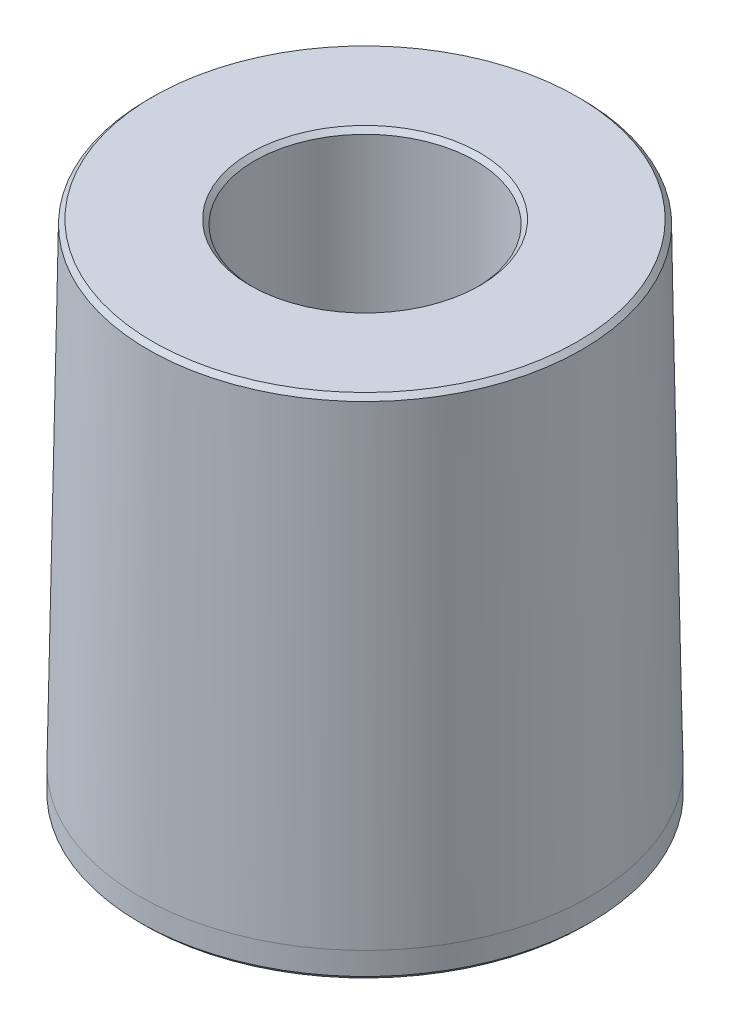
ISO-10303-21;
HEADER;
FILE_DESCRIPTION(('STEP AP214'),'2;1');
FILE_NAME('part.step','',(''),(''),'','','');
FILE_SCHEMA(('AUTOMOTIVE_DESIGN { 1 0 10303 214 1 1 1 1 }'));
ENDSEC;
DATA;
#1=APPLICATION_CONTEXT('core data for automotive mechanical design processes');
#2=APPLICATION_PROTOCOL_DEFINITION('international standard','automotive_design',2000,#1);
#3=PRODUCT_CONTEXT('',#1,'mechanical');
#4=PRODUCT('Part','Part','',(#3));
#5=PRODUCT_RELATED_PRODUCT_CATEGORY('part','',(#4));
#6=PRODUCT_DEFINITION_FORMATION('','',#4);
#7=PRODUCT_DEFINITION_CONTEXT('part definition',#1,'design');
#8=PRODUCT_DEFINITION('design','',#6,#7);
#9=PRODUCT_DEFINITION_SHAPE('','',#8);
#10=(LENGTH_UNIT() NAMED_UNIT(*) SI_UNIT(.MILLI.,.METRE.));
#11=(NAMED_UNIT(*) PLANE_ANGLE_UNIT() SI_UNIT($,.RADIAN.));
#12=(NAMED_UNIT(*) SI_UNIT($,.STERADIAN.) SOLID_ANGLE_UNIT());
#13=UNCERTAINTY_MEASURE_WITH_UNIT(LENGTH_MEASURE(1.E-05),#10,'distance_accuracy_value','');
#14=(GEOMETRIC_REPRESENTATION_CONTEXT(3) GLOBAL_UNCERTAINTY_ASSIGNED_CONTEXT((#13)) GLOBAL_UNIT_ASSIGNED_CONTEXT((#10,
#11,#12)) REPRESENTATION_CONTEXT('',''));
#15=CARTESIAN_POINT('',(0.,0.,0.));
#16=DIRECTION('',(0.,0.,1.));
#17=DIRECTION('',(1.,0.,0.));
#18=AXIS2_PLACEMENT_3D('',#15,#16,#17);
#19=CARTESIAN_POINT('',(-47.9999999999999,104.960440745704,0.));
#20=DIRECTION('',(0.,-1.,0.));
#21=DIRECTION('',(1.,0.,0.));
#22=AXIS2_PLACEMENT_3D('',#19,#20,#21);
#23=PLANE('',#22);
#24=CARTESIAN_POINT('',(0.,104.960440745704,0.));
#25=DIRECTION('',(0.,-1.,0.));
#26=DIRECTION('',(1.,0.,0.));
#27=AXIS2_PLACEMENT_3D('',#24,#25,#26);
#28=CIRCLE('',#27,25.45);
#29=CARTESIAN_POINT('',(25.45,104.960440745704,0.));
#30=VERTEX_POINT('',#29);
#31=EDGE_CURVE('E42',#30,#30,#28,.T.);
#32=ORIENTED_EDGE('',*,*,#31,.T.);
#33=EDGE_LOOP('',(#32));
#34=FACE_BOUND('',#33,.T.);
#35=CARTESIAN_POINT('',(0.,104.960440745704,0.));
#36=DIRECTION('',(0.,-1.,0.));
#37=DIRECTION('',(1.,0.,0.));
#38=AXIS2_PLACEMENT_3D('',#35,#36,#37);
#39=CIRCLE('',#38,46.9999999999999);
#40=CARTESIAN_POINT('',(46.9999999999999,104.960440745704,0.));
#41=VERTEX_POINT('',#40);
#42=EDGE_CURVE('E46',#41,#41,#39,.F.);
#43=ORIENTED_EDGE('',*,*,#42,.T.);
#44=EDGE_LOOP('',(#43));
#45=FACE_BOUND('',#44,.T.);
#46=ADVANCED_FACE('F31',(#34,#45),#23,.F.);
#47=CARTESIAN_POINT('',(0.,104.960440745704,0.));
#48=DIRECTION('',(0.,-1.,0.));
#49=DIRECTION('',(1.,0.,0.));
#50=AXIS2_PLACEMENT_3D('',#47,#48,#49);
#51=CONICAL_SURFACE('',#50,47.9999999999999,0.0174532925199364);
#52=CARTESIAN_POINT('',(0.,103.942675588809,0.));
#53=DIRECTION('',(0.,1.,0.));
#54=DIRECTION('',(-1.,0.,0.));
#55=AXIS2_PLACEMENT_3D('',#52,#53,#54);
#56=CIRCLE('',#55,48.0177651568952);
#57=CARTESIAN_POINT('',(-48.0177651568952,103.942675588809,0.));
#58=VERTEX_POINT('',#57);
#59=EDGE_CURVE('E10',#58,#58,#56,.F.);
#60=ORIENTED_EDGE('',*,*,#59,.T.);
#61=EDGE_LOOP('',(#60));
#62=FACE_BOUND('',#61,.T.);
#63=CARTESIAN_POINT('',(0.,-0.0395592542957179,0.));
#64=DIRECTION('',(0.,-1.,0.));
#65=DIRECTION('',(1.,0.,0.));
#66=AXIS2_PLACEMENT_3D('',#63,#64,#65);
#67=CIRCLE('',#66,49.832781817462);
#68=CARTESIAN_POINT('',(49.832781817462,-0.0395592542957179,0.));
#69=VERTEX_POINT('',#68);
#70=EDGE_CURVE('E63',#69,#69,#67,.T.);
#71=ORIENTED_EDGE('',*,*,#70,.F.);
#72=EDGE_LOOP('',(#71));
#73=FACE_BOUND('',#72,.T.);
#74=ADVANCED_FACE('F93',(#62,#73),#51,.T.);
#75=CARTESIAN_POINT('',(0.,0.,0.));
#76=DIRECTION('',(0.,-1.,0.));
#77=DIRECTION('',(1.,0.,0.));
#78=AXIS2_PLACEMENT_3D('',#75,#76,#77);
#79=CYLINDRICAL_SURFACE('',#78,49.8327818174621);
#80=CARTESIAN_POINT('',(0.,-5.03955925429578,0.));
#81=DIRECTION('',(0.,1.,0.));
#82=DIRECTION('',(-1.,0.,0.));
#83=AXIS2_PLACEMENT_3D('',#80,#81,#82);
#84=CIRCLE('',#83,49.8327818174621);
#85=CARTESIAN_POINT('',(-49.8327818174621,-5.03955925429578,0.));
#86=VERTEX_POINT('',#85);
#87=EDGE_CURVE('E54',#86,#86,#84,.T.);
#88=ORIENTED_EDGE('',*,*,#87,.T.);
#89=EDGE_LOOP('',(#88));
#90=FACE_BOUND('',#89,.T.);
#91=ORIENTED_EDGE('',*,*,#70,.T.);
#92=EDGE_LOOP('',(#91));
#93=FACE_BOUND('',#92,.T.);
#94=ADVANCED_FACE('F89',(#90,#93),#79,.T.);
#95=CARTESIAN_POINT('',(-23.45,-6.03955925429572,0.));
#96=DIRECTION('',(0.,1.,0.));
#97=DIRECTION('',(-1.,0.,0.));
#98=AXIS2_PLACEMENT_3D('',#95,#96,#97);
#99=PLANE('',#98);
#100=CARTESIAN_POINT('',(0.,-6.03955925429572,0.));
#101=DIRECTION('',(0.,1.,0.));
#102=DIRECTION('',(-1.,0.,0.));
#103=AXIS2_PLACEMENT_3D('',#100,#101,#102);
#104=CIRCLE('',#103,48.8327818174621);
#105=CARTESIAN_POINT('',(-48.8327818174621,-6.03955925429572,0.));
#106=VERTEX_POINT('',#105);
#107=EDGE_CURVE('E57',#106,#106,#104,.F.);
#108=ORIENTED_EDGE('',*,*,#107,.T.);
#109=EDGE_LOOP('',(#108));
#110=FACE_BOUND('',#109,.T.);
#111=CARTESIAN_POINT('',(0.,-6.03955925429572,0.));
#112=DIRECTION('',(0.,1.,0.));
#113=DIRECTION('',(-1.,0.,0.));
#114=AXIS2_PLACEMENT_3D('',#111,#112,#113);
#115=CIRCLE('',#114,24.4500000000001);
#116=CARTESIAN_POINT('',(-24.4500000000001,-6.03955925429572,0.));
#117=VERTEX_POINT('',#116);
#118=EDGE_CURVE('E60',#117,#117,#115,.T.);
#119=ORIENTED_EDGE('',*,*,#118,.T.);
#120=EDGE_LOOP('',(#119));
#121=FACE_BOUND('',#120,.T.);
#122=ADVANCED_FACE('F83',(#110,#121),#99,.F.);
#123=CARTESIAN_POINT('',(0.,0.,0.));
#124=DIRECTION('',(0.,-1.,0.));
#125=DIRECTION('',(1.,0.,0.));
#126=AXIS2_PLACEMENT_3D('',#123,#124,#125);
#127=CYLINDRICAL_SURFACE('',#126,23.45);
#128=CARTESIAN_POINT('',(0.,-5.03955925429569,0.));
#129=DIRECTION('',(0.,1.,0.));
#130=DIRECTION('',(-1.,0.,0.));
#131=AXIS2_PLACEMENT_3D('',#128,#129,#130);
#132=CIRCLE('',#131,23.45);
#133=CARTESIAN_POINT('',(-23.45,-5.03955925429569,0.));
#134=VERTEX_POINT('',#133);
#135=EDGE_CURVE('E51',#134,#134,#132,.F.);
#136=ORIENTED_EDGE('',*,*,#135,.T.);
#137=EDGE_LOOP('',(#136));
#138=FACE_BOUND('',#137,.T.);
#139=CARTESIAN_POINT('',(0.,13.9604407457043,0.));
#140=DIRECTION('',(0.,-1.,0.));
#141=DIRECTION('',(1.,0.,0.));
#142=AXIS2_PLACEMENT_3D('',#139,#140,#141);
#143=CIRCLE('',#142,23.45);
#144=CARTESIAN_POINT('',(23.45,13.9604407457043,0.));
#145=VERTEX_POINT('',#144);
#146=EDGE_CURVE('E66',#145,#145,#143,.T.);
#147=ORIENTED_EDGE('',*,*,#146,.F.);
#148=EDGE_LOOP('',(#147));
#149=FACE_BOUND('',#148,.T.);
#150=ADVANCED_FACE('F78',(#138,#149),#127,.F.);
#151=CARTESIAN_POINT('',(0.,14.9604407457043,0.));
#152=DIRECTION('',(0.,-1.,0.));
#153=DIRECTION('',(1.,0.,0.));
#154=AXIS2_PLACEMENT_3D('',#151,#152,#153);
#155=TOROIDAL_SURFACE('',#154,23.45,0.999999999999999);
#156=CARTESIAN_POINT('',(0.,14.9604407457043,0.));
#157=DIRECTION('',(0.,-1.,0.));
#158=DIRECTION('',(1.,0.,0.));
#159=AXIS2_PLACEMENT_3D('',#156,#157,#158);
#160=CIRCLE('',#159,24.45);
#161=CARTESIAN_POINT('',(24.45,14.9604407457043,0.));
#162=VERTEX_POINT('',#161);
#163=EDGE_CURVE('E69',#162,#162,#160,.T.);
#164=ORIENTED_EDGE('',*,*,#163,.F.);
#165=EDGE_LOOP('',(#164));
#166=FACE_BOUND('',#165,.T.);
#167=ORIENTED_EDGE('',*,*,#146,.T.);
#168=EDGE_LOOP('',(#167));
#169=FACE_BOUND('',#168,.T.);
#170=ADVANCED_FACE('F75',(#166,#169),#155,.F.);
#171=CARTESIAN_POINT('',(0.,0.,0.));
#172=DIRECTION('',(0.,-1.,0.));
#173=DIRECTION('',(1.,0.,0.));
#174=AXIS2_PLACEMENT_3D('',#171,#172,#173);
#175=CYLINDRICAL_SURFACE('',#174,24.45);
#176=CARTESIAN_POINT('',(0.,103.960440745704,0.));
#177=DIRECTION('',(0.,-1.,0.));
#178=DIRECTION('',(1.,0.,0.));
#179=AXIS2_PLACEMENT_3D('',#176,#177,#178);
#180=CIRCLE('',#179,24.45);
#181=CARTESIAN_POINT('',(24.45,103.960440745704,0.));
#182=VERTEX_POINT('',#181);
#183=EDGE_CURVE('E38',#182,#182,#180,.F.);
#184=ORIENTED_EDGE('',*,*,#183,.T.);
#185=EDGE_LOOP('',(#184));
#186=FACE_BOUND('',#185,.T.);
#187=ORIENTED_EDGE('',*,*,#163,.T.);
#188=EDGE_LOOP('',(#187));
#189=FACE_BOUND('',#188,.T.);
#190=ADVANCED_FACE('F73',(#186,#189),#175,.F.);
#191=CARTESIAN_POINT('',(0.,-6.03955925429572,0.));
#192=DIRECTION('',(0.,1.,0.));
#193=DIRECTION('',(-1.,0.,0.));
#194=AXIS2_PLACEMENT_3D('',#191,#192,#193);
#195=CONICAL_SURFACE('',#194,48.8327818174621,0.785398163397448);
#196=ORIENTED_EDGE('',*,*,#87,.F.);
#197=EDGE_LOOP('',(#196));
#198=FACE_BOUND('',#197,.T.);
#199=ORIENTED_EDGE('',*,*,#107,.F.);
#200=EDGE_LOOP('',(#199));
#201=FACE_BOUND('',#200,.T.);
#202=ADVANCED_FACE('F103',(#198,#201),#195,.T.);
#203=CARTESIAN_POINT('',(0.,-5.03955925429569,0.));
#204=DIRECTION('',(0.,-1.,0.));
#205=DIRECTION('',(1.,0.,0.));
#206=AXIS2_PLACEMENT_3D('',#203,#204,#205);
#207=CONICAL_SURFACE('',#206,23.45,0.785398163397462);
#208=ORIENTED_EDGE('',*,*,#118,.F.);
#209=EDGE_LOOP('',(#208));
#210=FACE_BOUND('',#209,.T.);
#211=ORIENTED_EDGE('',*,*,#135,.F.);
#212=EDGE_LOOP('',(#211));
#213=FACE_BOUND('',#212,.T.);
#214=ADVANCED_FACE('F106',(#210,#213),#207,.F.);
#215=CARTESIAN_POINT('',(0.,104.960440745704,0.));
#216=DIRECTION('',(0.,1.,0.));
#217=DIRECTION('',(-1.,0.,0.));
#218=AXIS2_PLACEMENT_3D('',#215,#216,#217);
#219=CONICAL_SURFACE('',#218,25.45,0.78539816339744);
#220=ORIENTED_EDGE('',*,*,#183,.F.);
#221=EDGE_LOOP('',(#220));
#222=FACE_BOUND('',#221,.T.);
#223=ORIENTED_EDGE('',*,*,#31,.F.);
#224=EDGE_LOOP('',(#223));
#225=FACE_BOUND('',#224,.T.);
#226=ADVANCED_FACE('F109',(#222,#225),#219,.F.);
#227=CARTESIAN_POINT('',(0.,103.942675588809,0.));
#228=DIRECTION('',(0.,-1.,0.));
#229=DIRECTION('',(1.,0.,0.));
#230=AXIS2_PLACEMENT_3D('',#227,#228,#229);
#231=CONICAL_SURFACE('',#230,48.0177651568952,0.785398163397448);
#232=ORIENTED_EDGE('',*,*,#42,.F.);
#233=EDGE_LOOP('',(#232));
#234=FACE_BOUND('',#233,.T.);
#235=ORIENTED_EDGE('',*,*,#59,.F.);
#236=EDGE_LOOP('',(#235));
#237=FACE_BOUND('',#236,.T.);
#238=ADVANCED_FACE('F33',(#234,#237),#231,.T.);
#239=CLOSED_SHELL('',(#46,#74,#94,#122,#150,#170,#190,#202,#214,#226,#238));
#240=MANIFOLD_SOLID_BREP('B2',#239);
#241=ADVANCED_BREP_SHAPE_REPRESENTATION('',(#18,#240),#14);
#242=SHAPE_DEFINITION_REPRESENTATION(#9,#241);
ENDSEC;
END-ISO-10303-21;
